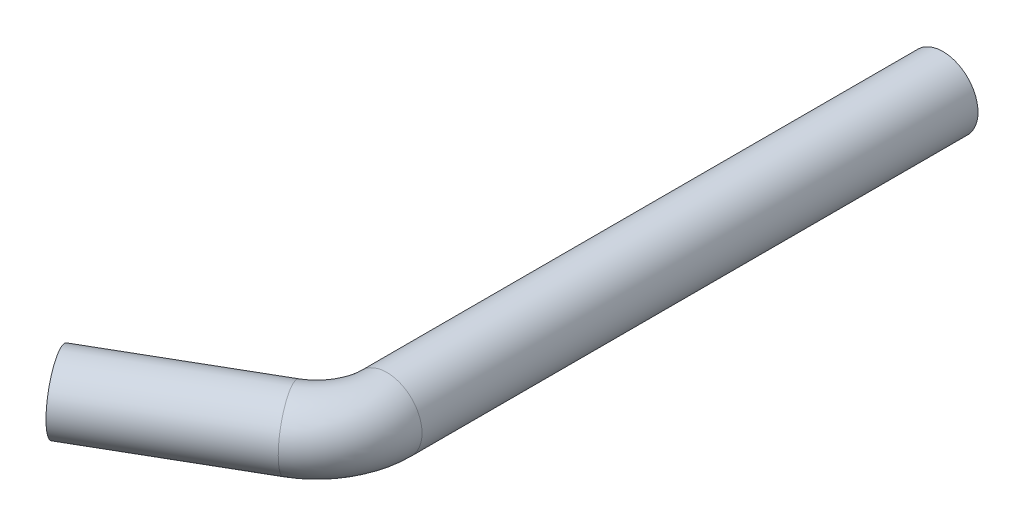
ISO-10303-21;
HEADER;
FILE_DESCRIPTION(('STEP AP214'),'2;1');
FILE_NAME('part.step','',(''),(''),'','','');
FILE_SCHEMA(('AUTOMOTIVE_DESIGN { 1 0 10303 214 1 1 1 1 }'));
ENDSEC;
DATA;
#1=APPLICATION_CONTEXT('core data for automotive mechanical design processes');
#2=APPLICATION_PROTOCOL_DEFINITION('international standard','automotive_design',2000,#1);
#3=PRODUCT_CONTEXT('',#1,'mechanical');
#4=PRODUCT('Part','Part','',(#3));
#5=PRODUCT_RELATED_PRODUCT_CATEGORY('part','',(#4));
#6=PRODUCT_DEFINITION_FORMATION('','',#4);
#7=PRODUCT_DEFINITION_CONTEXT('part definition',#1,'design');
#8=PRODUCT_DEFINITION('design','',#6,#7);
#9=PRODUCT_DEFINITION_SHAPE('','',#8);
#10=(LENGTH_UNIT() NAMED_UNIT(*) SI_UNIT(.MILLI.,.METRE.));
#11=(NAMED_UNIT(*) PLANE_ANGLE_UNIT() SI_UNIT($,.RADIAN.));
#12=(NAMED_UNIT(*) SI_UNIT($,.STERADIAN.) SOLID_ANGLE_UNIT());
#13=UNCERTAINTY_MEASURE_WITH_UNIT(LENGTH_MEASURE(1.E-05),#10,'distance_accuracy_value','');
#14=(GEOMETRIC_REPRESENTATION_CONTEXT(3) GLOBAL_UNCERTAINTY_ASSIGNED_CONTEXT((#13)) GLOBAL_UNIT_ASSIGNED_CONTEXT((#10,
#11,#12)) REPRESENTATION_CONTEXT('',''));
#15=CARTESIAN_POINT('',(0.,0.,0.));
#16=DIRECTION('',(0.,0.,1.));
#17=DIRECTION('',(1.,0.,0.));
#18=AXIS2_PLACEMENT_3D('',#15,#16,#17);
#19=CARTESIAN_POINT('',(0.,0.,0.));
#20=DIRECTION('',(0.,0.,1.));
#21=DIRECTION('',(1.,0.,0.));
#22=AXIS2_PLACEMENT_3D('',#19,#20,#21);
#23=PLANE('',#22);
#24=CARTESIAN_POINT('',(0.,0.,0.));
#25=DIRECTION('',(0.,0.,1.));
#26=DIRECTION('',(1.,0.,0.));
#27=AXIS2_PLACEMENT_3D('',#24,#25,#26);
#28=CIRCLE('',#27,5.);
#29=CARTESIAN_POINT('',(5.,0.,0.));
#30=VERTEX_POINT('',#29);
#31=EDGE_CURVE('E64',#30,#30,#28,.T.);
#32=ORIENTED_EDGE('',*,*,#31,.F.);
#33=EDGE_LOOP('',(#32));
#34=FACE_BOUND('',#33,.T.);
#35=ADVANCED_FACE('F47',(#34),#23,.F.);
#36=CARTESIAN_POINT('',(-25.9807621135333,0.,100.));
#37=DIRECTION('',(-0.866025403784439,0.,0.499999999999999));
#38=DIRECTION('',(0.499999999999999,0.,0.866025403784439));
#39=AXIS2_PLACEMENT_3D('',#36,#37,#38);
#40=PLANE('',#39);
#41=CARTESIAN_POINT('',(-25.9807621135333,0.,100.));
#42=DIRECTION('',(-0.866025403784439,0.,0.499999999999999));
#43=DIRECTION('',(0.499999999999999,0.,0.866025403784439));
#44=AXIS2_PLACEMENT_3D('',#41,#42,#43);
#45=CIRCLE('',#44,5.);
#46=CARTESIAN_POINT('',(-23.4807621135333,0.,104.330127018922));
#47=VERTEX_POINT('',#46);
#48=EDGE_CURVE('E12',#47,#47,#45,.T.);
#49=ORIENTED_EDGE('',*,*,#48,.T.);
#50=EDGE_LOOP('',(#49));
#51=FACE_BOUND('',#50,.T.);
#52=ADVANCED_FACE('F74',(#51),#40,.T.);
#53=CARTESIAN_POINT('',(0.,0.,0.));
#54=DIRECTION('',(0.,0.,1.));
#55=DIRECTION('',(1.,0.,0.));
#56=AXIS2_PLACEMENT_3D('',#53,#54,#55);
#57=CYLINDRICAL_SURFACE('',#56,5.);
#58=CARTESIAN_POINT('',(0.,0.,79.2264973081037));
#59=DIRECTION('',(0.,0.,1.));
#60=DIRECTION('',(1.,0.,0.));
#61=AXIS2_PLACEMENT_3D('',#58,#59,#60);
#62=CIRCLE('',#61,5.);
#63=CARTESIAN_POINT('',(5.,0.,79.2264973081036));
#64=VERTEX_POINT('',#63);
#65=EDGE_CURVE('E59',#64,#64,#62,.T.);
#66=ORIENTED_EDGE('',*,*,#65,.F.);
#67=EDGE_LOOP('',(#66));
#68=FACE_BOUND('',#67,.T.);
#69=ORIENTED_EDGE('',*,*,#31,.T.);
#70=EDGE_LOOP('',(#69));
#71=FACE_BOUND('',#70,.T.);
#72=ADVANCED_FACE('F71',(#68,#71),#57,.T.);
#73=CARTESIAN_POINT('',(-10.,0.,79.2264973081037));
#74=DIRECTION('',(0.,-1.,0.));
#75=DIRECTION('',(0.,0.,-1.));
#76=AXIS2_PLACEMENT_3D('',#73,#74,#75);
#77=TOROIDAL_SURFACE('',#76,10.,5.);
#78=CARTESIAN_POINT('',(-5.00000000000005,0.,87.8867513459482));
#79=DIRECTION('',(-0.866025403784442,0.,0.499999999999995));
#80=DIRECTION('',(0.499999999999995,0.,0.866025403784441));
#81=AXIS2_PLACEMENT_3D('',#78,#79,#80);
#82=CIRCLE('',#81,5.);
#83=CARTESIAN_POINT('',(-2.50000000000008,0.,92.2168783648704));
#84=VERTEX_POINT('',#83);
#85=EDGE_CURVE('E54',#84,#84,#82,.T.);
#86=CARTESIAN_POINT('',(-10.,0.,79.2264973081037));
#87=DIRECTION('',(0.,-1.,0.));
#88=DIRECTION('',(0.,0.,-1.));
#89=AXIS2_PLACEMENT_3D('',#86,#87,#88);
#90=CIRCLE('',#89,15.);
#91=EDGE_CURVE('',#64,#84,#90,.T.);
#92=ORIENTED_EDGE('',*,*,#65,.T.);
#93=ORIENTED_EDGE('',*,*,#85,.F.);
#94=ORIENTED_EDGE('',*,*,#91,.T.);
#95=ORIENTED_EDGE('',*,*,#91,.F.);
#96=EDGE_LOOP('',(#92,#94,#93,#95));
#97=FACE_BOUND('',#96,.T.);
#98=ADVANCED_FACE('F80',(#97),#77,.T.);
#99=CARTESIAN_POINT('',(-5.00000000000005,0.,87.8867513459482));
#100=DIRECTION('',(-0.86602540378444,0.,0.499999999999999));
#101=DIRECTION('',(0.499999999999999,0.,0.866025403784439));
#102=AXIS2_PLACEMENT_3D('',#99,#100,#101);
#103=CYLINDRICAL_SURFACE('',#102,5.);
#104=ORIENTED_EDGE('',*,*,#48,.F.);
#105=EDGE_LOOP('',(#104));
#106=FACE_BOUND('',#105,.T.);
#107=ORIENTED_EDGE('',*,*,#85,.T.);
#108=EDGE_LOOP('',(#107));
#109=FACE_BOUND('',#108,.T.);
#110=ADVANCED_FACE('F78',(#106,#109),#103,.T.);
#111=CLOSED_SHELL('',(#35,#52,#72,#98,#110));
#112=MANIFOLD_SOLID_BREP('B2',#111);
#113=ADVANCED_BREP_SHAPE_REPRESENTATION('',(#18,#112),#14);
#114=SHAPE_DEFINITION_REPRESENTATION(#9,#113);
ENDSEC;
END-ISO-10303-21;
